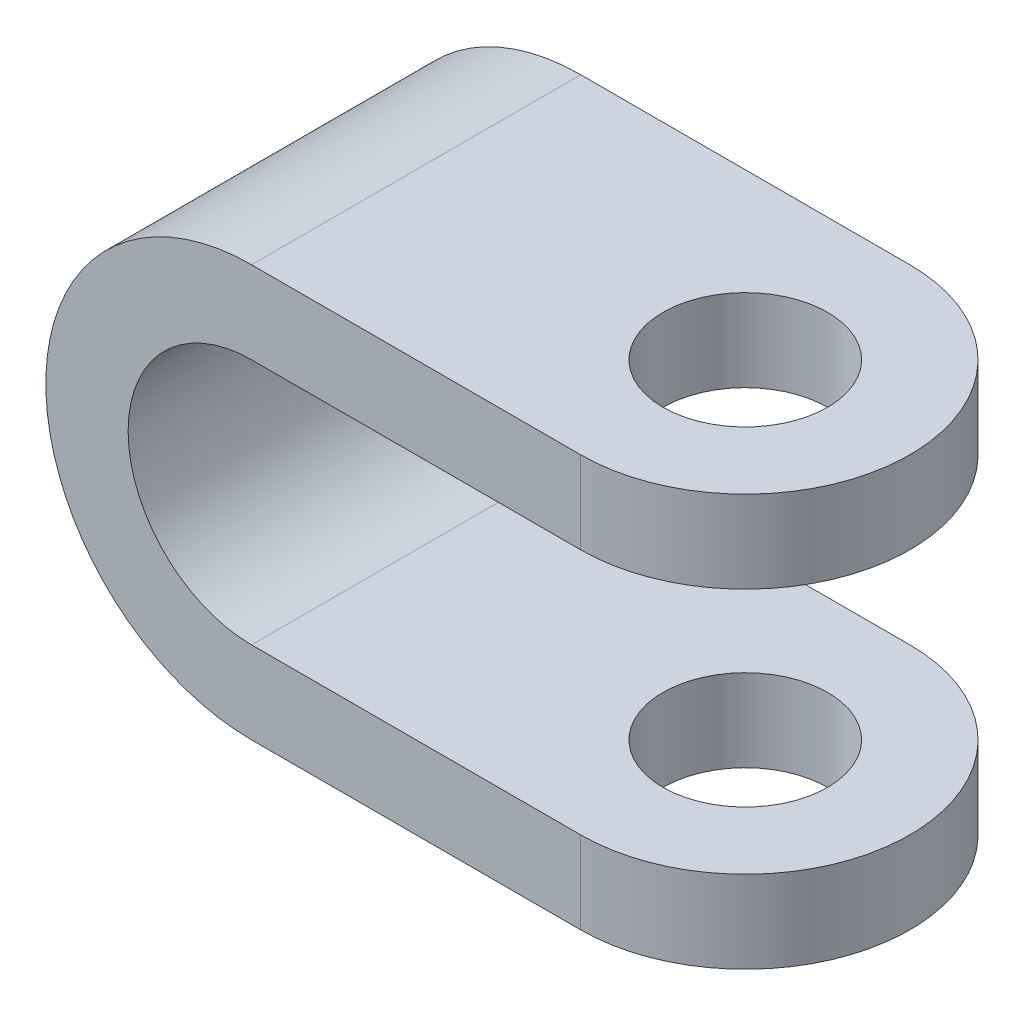
ISO-10303-21;
HEADER;
FILE_DESCRIPTION(('STEP AP214'),'2;1');
FILE_NAME('part.step','',(''),(''),'','','');
FILE_SCHEMA(('AUTOMOTIVE_DESIGN { 1 0 10303 214 1 1 1 1 }'));
ENDSEC;
DATA;
#1=APPLICATION_CONTEXT('core data for automotive mechanical design processes');
#2=APPLICATION_PROTOCOL_DEFINITION('international standard','automotive_design',2000,#1);
#3=PRODUCT_CONTEXT('',#1,'mechanical');
#4=PRODUCT('Part','Part','',(#3));
#5=PRODUCT_RELATED_PRODUCT_CATEGORY('part','',(#4));
#6=PRODUCT_DEFINITION_FORMATION('','',#4);
#7=PRODUCT_DEFINITION_CONTEXT('part definition',#1,'design');
#8=PRODUCT_DEFINITION('design','',#6,#7);
#9=PRODUCT_DEFINITION_SHAPE('','',#8);
#10=(LENGTH_UNIT() NAMED_UNIT(*) SI_UNIT(.MILLI.,.METRE.));
#11=(NAMED_UNIT(*) PLANE_ANGLE_UNIT() SI_UNIT($,.RADIAN.));
#12=(NAMED_UNIT(*) SI_UNIT($,.STERADIAN.) SOLID_ANGLE_UNIT());
#13=UNCERTAINTY_MEASURE_WITH_UNIT(LENGTH_MEASURE(1.E-05),#10,'distance_accuracy_value','');
#14=(GEOMETRIC_REPRESENTATION_CONTEXT(3) GLOBAL_UNCERTAINTY_ASSIGNED_CONTEXT((#13)) GLOBAL_UNIT_ASSIGNED_CONTEXT((#10,
#11,#12)) REPRESENTATION_CONTEXT('',''));
#15=CARTESIAN_POINT('',(0.,0.,0.));
#16=DIRECTION('',(0.,0.,1.));
#17=DIRECTION('',(1.,0.,0.));
#18=AXIS2_PLACEMENT_3D('',#15,#16,#17);
#19=CARTESIAN_POINT('',(-85.,-90.,65.));
#20=DIRECTION('',(0.,0.,1.));
#21=DIRECTION('',(1.,0.,0.));
#22=AXIS2_PLACEMENT_3D('',#19,#20,#21);
#23=PLANE('',#22);
#24=DIRECTION('',(1.,0.,0.));
#25=VECTOR('',#24,1.);
#26=CARTESIAN_POINT('',(-60.,-55.,65.));
#27=LINE('',#26,#25);
#28=CARTESIAN_POINT('',(-60.,-55.,65.));
#29=VERTEX_POINT('',#28);
#30=CARTESIAN_POINT('',(-20.,-55.,65.));
#31=VERTEX_POINT('',#30);
#32=EDGE_CURVE('E128',#29,#31,#27,.T.);
#33=ORIENTED_EDGE('',*,*,#32,.F.);
#34=CARTESIAN_POINT('',(-60.,-40.,65.));
#35=DIRECTION('',(0.,0.,1.));
#36=DIRECTION('',(1.,0.,0.));
#37=AXIS2_PLACEMENT_3D('',#34,#35,#36);
#38=CIRCLE('',#37,15.);
#39=CARTESIAN_POINT('',(-60.,-25.,65.));
#40=VERTEX_POINT('',#39);
#41=EDGE_CURVE('E141',#40,#29,#38,.T.);
#42=ORIENTED_EDGE('',*,*,#41,.F.);
#43=DIRECTION('',(-1.,0.,0.));
#44=VECTOR('',#43,1.);
#45=CARTESIAN_POINT('',(0.,-25.,65.));
#46=LINE('',#45,#44);
#47=CARTESIAN_POINT('',(-20.,-25.,65.));
#48=VERTEX_POINT('',#47);
#49=EDGE_CURVE('E148',#48,#40,#46,.T.);
#50=ORIENTED_EDGE('',*,*,#49,.F.);
#51=DIRECTION('',(0.,1.,0.));
#52=VECTOR('',#51,1.);
#53=CARTESIAN_POINT('',(-20.,-90.,65.));
#54=LINE('',#53,#52);
#55=CARTESIAN_POINT('',(-20.,-15.,65.));
#56=VERTEX_POINT('',#55);
#57=EDGE_CURVE('E133',#48,#56,#54,.T.);
#58=ORIENTED_EDGE('',*,*,#57,.T.);
#59=DIRECTION('',(-1.,0.,0.));
#60=VECTOR('',#59,1.);
#61=CARTESIAN_POINT('',(0.,-15.,65.));
#62=LINE('',#61,#60);
#63=CARTESIAN_POINT('',(-60.,-15.,65.));
#64=VERTEX_POINT('',#63);
#65=EDGE_CURVE('E248',#56,#64,#62,.T.);
#66=ORIENTED_EDGE('',*,*,#65,.T.);
#67=CARTESIAN_POINT('',(-60.,-40.,65.));
#68=DIRECTION('',(0.,0.,1.));
#69=DIRECTION('',(1.,0.,0.));
#70=AXIS2_PLACEMENT_3D('',#67,#68,#69);
#71=CIRCLE('',#70,25.);
#72=CARTESIAN_POINT('',(-60.,-65.,65.));
#73=VERTEX_POINT('',#72);
#74=EDGE_CURVE('E192',#64,#73,#71,.T.);
#75=ORIENTED_EDGE('',*,*,#74,.T.);
#76=DIRECTION('',(1.,0.,0.));
#77=VECTOR('',#76,1.);
#78=CARTESIAN_POINT('',(-60.,-65.,65.));
#79=LINE('',#78,#77);
#80=CARTESIAN_POINT('',(-20.,-65.,65.));
#81=VERTEX_POINT('',#80);
#82=EDGE_CURVE('E130',#73,#81,#79,.T.);
#83=ORIENTED_EDGE('',*,*,#82,.T.);
#84=EDGE_CURVE('E117',#81,#31,#54,.T.);
#85=ORIENTED_EDGE('',*,*,#84,.T.);
#86=EDGE_LOOP('',(#33,#42,#50,#58,#66,#75,#83,#85));
#87=FACE_BOUND('',#86,.T.);
#88=ADVANCED_FACE('F49',(#87),#23,.T.);
#89=CARTESIAN_POINT('',(-20.,-90.,25.));
#90=DIRECTION('',(0.,0.,-1.));
#91=DIRECTION('',(-1.,0.,0.));
#92=AXIS2_PLACEMENT_3D('',#89,#90,#91);
#93=PLANE('',#92);
#94=DIRECTION('',(-1.,0.,0.));
#95=VECTOR('',#94,1.);
#96=CARTESIAN_POINT('',(-60.,-55.,25.));
#97=LINE('',#96,#95);
#98=CARTESIAN_POINT('',(-20.,-55.,25.));
#99=VERTEX_POINT('',#98);
#100=CARTESIAN_POINT('',(-60.,-55.,25.));
#101=VERTEX_POINT('',#100);
#102=EDGE_CURVE('E163',#99,#101,#97,.T.);
#103=ORIENTED_EDGE('',*,*,#102,.F.);
#104=DIRECTION('',(0.,1.,0.));
#105=VECTOR('',#104,1.);
#106=CARTESIAN_POINT('',(-20.,-90.,25.));
#107=LINE('',#106,#105);
#108=CARTESIAN_POINT('',(-20.,-65.,25.));
#109=VERTEX_POINT('',#108);
#110=EDGE_CURVE('E119',#109,#99,#107,.T.);
#111=ORIENTED_EDGE('',*,*,#110,.F.);
#112=DIRECTION('',(-1.,0.,0.));
#113=VECTOR('',#112,1.);
#114=CARTESIAN_POINT('',(-60.,-65.,25.));
#115=LINE('',#114,#113);
#116=CARTESIAN_POINT('',(-60.,-65.,25.0000000000001));
#117=VERTEX_POINT('',#116);
#118=EDGE_CURVE('E146',#109,#117,#115,.T.);
#119=ORIENTED_EDGE('',*,*,#118,.T.);
#120=CARTESIAN_POINT('',(-60.,-40.,25.));
#121=DIRECTION('',(0.,0.,-1.));
#122=DIRECTION('',(-1.,0.,0.));
#123=AXIS2_PLACEMENT_3D('',#120,#121,#122);
#124=CIRCLE('',#123,25.);
#125=CARTESIAN_POINT('',(-60.,-15.,25.0000000000001));
#126=VERTEX_POINT('',#125);
#127=EDGE_CURVE('E195',#117,#126,#124,.T.);
#128=ORIENTED_EDGE('',*,*,#127,.T.);
#129=DIRECTION('',(1.,0.,0.));
#130=VECTOR('',#129,1.);
#131=CARTESIAN_POINT('',(0.,-15.,25.));
#132=LINE('',#131,#130);
#133=CARTESIAN_POINT('',(-20.,-15.,25.));
#134=VERTEX_POINT('',#133);
#135=EDGE_CURVE('E140',#126,#134,#132,.T.);
#136=ORIENTED_EDGE('',*,*,#135,.T.);
#137=CARTESIAN_POINT('',(-20.,-25.,25.));
#138=VERTEX_POINT('',#137);
#139=EDGE_CURVE('E132',#138,#134,#107,.T.);
#140=ORIENTED_EDGE('',*,*,#139,.F.);
#141=DIRECTION('',(1.,0.,0.));
#142=VECTOR('',#141,1.);
#143=CARTESIAN_POINT('',(0.,-25.,25.));
#144=LINE('',#143,#142);
#145=CARTESIAN_POINT('',(-60.,-25.,25.));
#146=VERTEX_POINT('',#145);
#147=EDGE_CURVE('E155',#146,#138,#144,.T.);
#148=ORIENTED_EDGE('',*,*,#147,.F.);
#149=CARTESIAN_POINT('',(-60.,-40.,25.));
#150=DIRECTION('',(0.,0.,-1.));
#151=DIRECTION('',(-1.,0.,0.));
#152=AXIS2_PLACEMENT_3D('',#149,#150,#151);
#153=CIRCLE('',#152,15.);
#154=EDGE_CURVE('E159',#101,#146,#153,.T.);
#155=ORIENTED_EDGE('',*,*,#154,.F.);
#156=EDGE_LOOP('',(#103,#111,#119,#128,#136,#140,#148,#155));
#157=FACE_BOUND('',#156,.T.);
#158=ADVANCED_FACE('F220',(#157),#93,.T.);
#159=CARTESIAN_POINT('',(-20.,-90.,45.));
#160=DIRECTION('',(0.,1.,0.));
#161=DIRECTION('',(0.,0.,1.));
#162=AXIS2_PLACEMENT_3D('',#159,#160,#161);
#163=CYLINDRICAL_SURFACE('',#162,20.);
#164=CARTESIAN_POINT('',(-20.,-25.,45.));
#165=DIRECTION('',(0.,-1.,0.));
#166=DIRECTION('',(1.,0.,0.));
#167=AXIS2_PLACEMENT_3D('',#164,#165,#166);
#168=CIRCLE('',#167,20.);
#169=EDGE_CURVE('E125',#138,#48,#168,.T.);
#170=ORIENTED_EDGE('',*,*,#169,.F.);
#171=ORIENTED_EDGE('',*,*,#139,.T.);
#172=CARTESIAN_POINT('',(-20.,-15.,45.));
#173=DIRECTION('',(0.,-1.,0.));
#174=DIRECTION('',(1.,0.,0.));
#175=AXIS2_PLACEMENT_3D('',#172,#173,#174);
#176=CIRCLE('',#175,20.);
#177=EDGE_CURVE('E53',#134,#56,#176,.T.);
#178=ORIENTED_EDGE('',*,*,#177,.T.);
#179=ORIENTED_EDGE('',*,*,#57,.F.);
#180=EDGE_LOOP('',(#170,#171,#178,#179));
#181=FACE_BOUND('',#180,.T.);
#182=ADVANCED_FACE('F224',(#181),#163,.T.);
#183=ORIENTED_EDGE('',*,*,#84,.F.);
#184=CARTESIAN_POINT('',(-20.,-65.,45.));
#185=DIRECTION('',(0.,1.,0.));
#186=DIRECTION('',(-1.,0.,0.));
#187=AXIS2_PLACEMENT_3D('',#184,#185,#186);
#188=CIRCLE('',#187,20.);
#189=EDGE_CURVE('E67',#81,#109,#188,.T.);
#190=ORIENTED_EDGE('',*,*,#189,.T.);
#191=ORIENTED_EDGE('',*,*,#110,.T.);
#192=CARTESIAN_POINT('',(-20.,-55.,45.));
#193=DIRECTION('',(0.,1.,0.));
#194=DIRECTION('',(-1.,0.,0.));
#195=AXIS2_PLACEMENT_3D('',#192,#193,#194);
#196=CIRCLE('',#195,20.);
#197=EDGE_CURVE('E114',#31,#99,#196,.T.);
#198=ORIENTED_EDGE('',*,*,#197,.F.);
#199=EDGE_LOOP('',(#183,#190,#191,#198));
#200=FACE_BOUND('',#199,.T.);
#201=ADVANCED_FACE('F116',(#200),#163,.T.);
#202=CARTESIAN_POINT('',(-60.,-40.,90.));
#203=DIRECTION('',(0.,0.,-1.));
#204=DIRECTION('',(-1.,0.,0.));
#205=AXIS2_PLACEMENT_3D('',#202,#203,#204);
#206=CYLINDRICAL_SURFACE('',#205,25.);
#207=DIRECTION('',(0.,0.,-1.));
#208=VECTOR('',#207,1.);
#209=CARTESIAN_POINT('',(-60.,-65.,90.));
#210=LINE('',#209,#208);
#211=EDGE_CURVE('E178',#73,#117,#210,.T.);
#212=ORIENTED_EDGE('',*,*,#211,.F.);
#213=ORIENTED_EDGE('',*,*,#74,.F.);
#214=DIRECTION('',(0.,0.,-1.));
#215=VECTOR('',#214,1.);
#216=CARTESIAN_POINT('',(-60.,-15.,90.));
#217=LINE('',#216,#215);
#218=EDGE_CURVE('E182',#64,#126,#217,.T.);
#219=ORIENTED_EDGE('',*,*,#218,.T.);
#220=ORIENTED_EDGE('',*,*,#127,.F.);
#221=EDGE_LOOP('',(#212,#213,#219,#220));
#222=FACE_BOUND('',#221,.T.);
#223=ADVANCED_FACE('F228',(#222),#206,.T.);
#224=CARTESIAN_POINT('',(0.,-15.,90.));
#225=DIRECTION('',(0.,-1.,0.));
#226=DIRECTION('',(1.,0.,0.));
#227=AXIS2_PLACEMENT_3D('',#224,#225,#226);
#228=PLANE('',#227);
#229=CARTESIAN_POINT('',(-20.,-15.,45.));
#230=DIRECTION('',(0.,-1.,0.));
#231=DIRECTION('',(1.,0.,0.));
#232=AXIS2_PLACEMENT_3D('',#229,#230,#231);
#233=CIRCLE('',#232,10.);
#234=CARTESIAN_POINT('',(-20.,-15.,55.));
#235=VERTEX_POINT('',#234);
#236=EDGE_CURVE('E166',#235,#235,#233,.T.);
#237=ORIENTED_EDGE('',*,*,#236,.T.);
#238=EDGE_LOOP('',(#237));
#239=FACE_BOUND('',#238,.T.);
#240=ORIENTED_EDGE('',*,*,#135,.F.);
#241=ORIENTED_EDGE('',*,*,#218,.F.);
#242=ORIENTED_EDGE('',*,*,#65,.F.);
#243=ORIENTED_EDGE('',*,*,#177,.F.);
#244=EDGE_LOOP('',(#240,#241,#242,#243));
#245=FACE_BOUND('',#244,.T.);
#246=ADVANCED_FACE('F201',(#239,#245),#228,.F.);
#247=CARTESIAN_POINT('',(-60.,-65.,90.));
#248=DIRECTION('',(0.,1.,0.));
#249=DIRECTION('',(-1.,0.,0.));
#250=AXIS2_PLACEMENT_3D('',#247,#248,#249);
#251=PLANE('',#250);
#252=CARTESIAN_POINT('',(-20.,-65.,45.));
#253=DIRECTION('',(0.,1.,0.));
#254=DIRECTION('',(-1.,0.,0.));
#255=AXIS2_PLACEMENT_3D('',#252,#253,#254);
#256=CIRCLE('',#255,10.);
#257=CARTESIAN_POINT('',(-20.,-65.,55.));
#258=VERTEX_POINT('',#257);
#259=EDGE_CURVE('E170',#258,#258,#256,.T.);
#260=ORIENTED_EDGE('',*,*,#259,.T.);
#261=EDGE_LOOP('',(#260));
#262=FACE_BOUND('',#261,.T.);
#263=ORIENTED_EDGE('',*,*,#118,.F.);
#264=ORIENTED_EDGE('',*,*,#189,.F.);
#265=ORIENTED_EDGE('',*,*,#82,.F.);
#266=ORIENTED_EDGE('',*,*,#211,.T.);
#267=EDGE_LOOP('',(#263,#264,#265,#266));
#268=FACE_BOUND('',#267,.T.);
#269=ADVANCED_FACE('F51',(#262,#268),#251,.F.);
#270=CARTESIAN_POINT('',(-20.,-90.,45.));
#271=DIRECTION('',(0.,1.,0.));
#272=DIRECTION('',(0.,0.,1.));
#273=AXIS2_PLACEMENT_3D('',#270,#271,#272);
#274=CYLINDRICAL_SURFACE('',#273,10.);
#275=CARTESIAN_POINT('',(-20.,-25.,45.));
#276=DIRECTION('',(0.,-1.,0.));
#277=DIRECTION('',(1.,0.,0.));
#278=AXIS2_PLACEMENT_3D('',#275,#276,#277);
#279=CIRCLE('',#278,10.);
#280=CARTESIAN_POINT('',(-20.,-25.,55.));
#281=VERTEX_POINT('',#280);
#282=EDGE_CURVE('E59',#281,#281,#279,.T.);
#283=CARTESIAN_POINT('',(-20.,-25.,55.));
#284=CARTESIAN_POINT('',(-20.,-24.8958333333333,55.));
#285=CARTESIAN_POINT('',(-20.,-24.7916666666667,55.));
#286=CARTESIAN_POINT('',(-20.,-24.5833333333333,55.));
#287=CARTESIAN_POINT('',(-20.,-24.4791666666667,55.));
#288=CARTESIAN_POINT('',(-20.,-24.2708333333333,55.));
#289=CARTESIAN_POINT('',(-20.,-24.1666666666667,55.));
#290=CARTESIAN_POINT('',(-20.,-23.9583333333333,55.));
#291=CARTESIAN_POINT('',(-20.,-23.8541666666667,55.));
#292=CARTESIAN_POINT('',(-20.,-23.6458333333333,55.));
#293=CARTESIAN_POINT('',(-20.,-23.5416666666667,55.));
#294=CARTESIAN_POINT('',(-20.,-23.3333333333333,55.));
#295=CARTESIAN_POINT('',(-20.,-23.2291666666667,55.));
#296=CARTESIAN_POINT('',(-20.,-23.0208333333333,55.));
#297=CARTESIAN_POINT('',(-20.,-22.9166666666667,55.));
#298=CARTESIAN_POINT('',(-20.,-22.7083333333333,55.));
#299=CARTESIAN_POINT('',(-20.,-22.6041666666667,55.));
#300=CARTESIAN_POINT('',(-20.,-22.3958333333333,55.));
#301=CARTESIAN_POINT('',(-20.,-22.2916666666667,55.));
#302=CARTESIAN_POINT('',(-20.,-22.0833333333333,55.));
#303=CARTESIAN_POINT('',(-20.,-21.9791666666667,55.));
#304=CARTESIAN_POINT('',(-20.,-21.7708333333333,55.));
#305=CARTESIAN_POINT('',(-20.,-21.6666666666667,55.));
#306=CARTESIAN_POINT('',(-20.,-21.4583333333333,55.));
#307=CARTESIAN_POINT('',(-20.,-21.3541666666667,55.));
#308=CARTESIAN_POINT('',(-20.,-21.1458333333333,55.));
#309=CARTESIAN_POINT('',(-20.,-21.0416666666667,55.));
#310=CARTESIAN_POINT('',(-20.,-20.8333333333333,55.));
#311=CARTESIAN_POINT('',(-20.,-20.7291666666667,55.));
#312=CARTESIAN_POINT('',(-20.,-20.5208333333333,55.));
#313=CARTESIAN_POINT('',(-20.,-20.4166666666667,55.));
#314=CARTESIAN_POINT('',(-20.,-20.2083333333333,55.));
#315=CARTESIAN_POINT('',(-20.,-20.1041666666667,55.));
#316=CARTESIAN_POINT('',(-20.,-19.8958333333333,55.));
#317=CARTESIAN_POINT('',(-20.,-19.7916666666667,55.));
#318=CARTESIAN_POINT('',(-20.,-19.5833333333333,55.));
#319=CARTESIAN_POINT('',(-20.,-19.4791666666667,55.));
#320=CARTESIAN_POINT('',(-20.,-19.2708333333333,55.));
#321=CARTESIAN_POINT('',(-20.,-19.1666666666667,55.));
#322=CARTESIAN_POINT('',(-20.,-18.9583333333333,55.));
#323=CARTESIAN_POINT('',(-20.,-18.8541666666667,55.));
#324=CARTESIAN_POINT('',(-20.,-18.6458333333333,55.));
#325=CARTESIAN_POINT('',(-20.,-18.5416666666667,55.));
#326=CARTESIAN_POINT('',(-20.,-18.3333333333333,55.));
#327=CARTESIAN_POINT('',(-20.,-18.2291666666667,55.));
#328=CARTESIAN_POINT('',(-20.,-18.0208333333333,55.));
#329=CARTESIAN_POINT('',(-20.,-17.9166666666667,55.));
#330=CARTESIAN_POINT('',(-20.,-17.7083333333333,55.));
#331=CARTESIAN_POINT('',(-20.,-17.6041666666667,55.));
#332=CARTESIAN_POINT('',(-20.,-17.3958333333333,55.));
#333=CARTESIAN_POINT('',(-20.,-17.2916666666667,55.));
#334=CARTESIAN_POINT('',(-20.,-17.0833333333333,55.));
#335=CARTESIAN_POINT('',(-20.,-16.9791666666667,55.));
#336=CARTESIAN_POINT('',(-20.,-16.7708333333333,55.));
#337=CARTESIAN_POINT('',(-20.,-16.6666666666667,55.));
#338=CARTESIAN_POINT('',(-20.,-16.4583333333333,55.));
#339=CARTESIAN_POINT('',(-20.,-16.3541666666667,55.));
#340=CARTESIAN_POINT('',(-20.,-16.1458333333333,55.));
#341=CARTESIAN_POINT('',(-20.,-16.0416666666667,55.));
#342=CARTESIAN_POINT('',(-20.,-15.8333333333333,55.));
#343=CARTESIAN_POINT('',(-20.,-15.7291666666667,55.));
#344=CARTESIAN_POINT('',(-20.,-15.5208333333333,55.));
#345=CARTESIAN_POINT('',(-20.,-15.4166666666667,55.));
#346=CARTESIAN_POINT('',(-20.,-15.2083333333333,55.));
#347=CARTESIAN_POINT('',(-20.,-15.1041666666667,55.));
#348=CARTESIAN_POINT('',(-20.,-15.,55.));
#349=B_SPLINE_CURVE_WITH_KNOTS('',3,(#283,#284,#285,#286,#287,#288,#289,#290,#291,#292,#293,
#294,#295,#296,#297,#298,#299,#300,#301,#302,#303,#304,#305,#306,#307,#308,#309,#310,#311,#312,
#313,#314,#315,#316,#317,#318,#319,#320,#321,#322,#323,#324,#325,#326,#327,#328,#329,#330,#331,
#332,#333,#334,#335,#336,#337,#338,#339,#340,#341,#342,#343,#344,#345,#346,#347,#348),
.UNSPECIFIED.,.F.,.F.,(4,2,2,2,2,2,2,2,2,2,2,2,2,2,2,2,2,2,2,2,2,2,2,2,2,2,2,2,2,2,2,2,4),(0.,
0.312499999999993,0.625000000000001,0.937500000000008,1.25,1.56249999999999,1.875,
2.18750000000001,2.5,2.8125,3.125,3.43750000000001,3.75,4.0625,4.375,4.68750000000001,5.,5.3125,
5.62500000000001,5.93750000000001,6.25000000000001,6.5625,6.87500000000001,7.18750000000001,
7.50000000000001,7.8125,8.12500000000001,8.43750000000001,8.75000000000001,9.0625,
9.37500000000001,9.68750000000002,10.),.UNSPECIFIED.);
#350=EDGE_CURVE('BSEAM204',#281,#235,#349,.T.);
#351=ORIENTED_EDGE('',*,*,#282,.T.);
#352=ORIENTED_EDGE('',*,*,#236,.F.);
#353=ORIENTED_EDGE('',*,*,#350,.T.);
#354=ORIENTED_EDGE('',*,*,#350,.F.);
#355=EDGE_LOOP('',(#351,#353,#352,#354));
#356=FACE_BOUND('',#355,.T.);
#357=ADVANCED_FACE('F204',(#356),#274,.F.);
#358=CARTESIAN_POINT('',(-60.,-55.,90.));
#359=DIRECTION('',(0.,1.,0.));
#360=DIRECTION('',(-1.,0.,0.));
#361=AXIS2_PLACEMENT_3D('',#358,#359,#360);
#362=PLANE('',#361);
#363=CARTESIAN_POINT('',(-20.,-55.,45.));
#364=DIRECTION('',(0.,1.,0.));
#365=DIRECTION('',(-1.,0.,0.));
#366=AXIS2_PLACEMENT_3D('',#363,#364,#365);
#367=CIRCLE('',#366,10.);
#368=CARTESIAN_POINT('',(-20.,-55.,55.));
#369=VERTEX_POINT('',#368);
#370=EDGE_CURVE('E11',#369,#369,#367,.T.);
#371=ORIENTED_EDGE('',*,*,#370,.F.);
#372=EDGE_LOOP('',(#371));
#373=FACE_BOUND('',#372,.T.);
#374=ORIENTED_EDGE('',*,*,#197,.T.);
#375=ORIENTED_EDGE('',*,*,#102,.T.);
#376=DIRECTION('',(0.,0.,-1.));
#377=VECTOR('',#376,1.);
#378=CARTESIAN_POINT('',(-60.,-55.,90.));
#379=LINE('',#378,#377);
#380=EDGE_CURVE('E138',#29,#101,#379,.T.);
#381=ORIENTED_EDGE('',*,*,#380,.F.);
#382=ORIENTED_EDGE('',*,*,#32,.T.);
#383=EDGE_LOOP('',(#374,#375,#381,#382));
#384=FACE_BOUND('',#383,.T.);
#385=ADVANCED_FACE('F136',(#373,#384),#362,.T.);
#386=CARTESIAN_POINT('',(0.,-25.,90.));
#387=DIRECTION('',(0.,-1.,0.));
#388=DIRECTION('',(1.,0.,0.));
#389=AXIS2_PLACEMENT_3D('',#386,#387,#388);
#390=PLANE('',#389);
#391=ORIENTED_EDGE('',*,*,#282,.F.);
#392=EDGE_LOOP('',(#391));
#393=FACE_BOUND('',#392,.T.);
#394=DIRECTION('',(0.,0.,-1.));
#395=VECTOR('',#394,1.);
#396=CARTESIAN_POINT('',(-60.,-25.,90.));
#397=LINE('',#396,#395);
#398=EDGE_CURVE('E186',#40,#146,#397,.T.);
#399=ORIENTED_EDGE('',*,*,#398,.T.);
#400=ORIENTED_EDGE('',*,*,#147,.T.);
#401=ORIENTED_EDGE('',*,*,#169,.T.);
#402=ORIENTED_EDGE('',*,*,#49,.T.);
#403=EDGE_LOOP('',(#399,#400,#401,#402));
#404=FACE_BOUND('',#403,.T.);
#405=ADVANCED_FACE('F212',(#393,#404),#390,.T.);
#406=CARTESIAN_POINT('',(-60.,-40.,90.));
#407=DIRECTION('',(0.,0.,-1.));
#408=DIRECTION('',(-1.,0.,0.));
#409=AXIS2_PLACEMENT_3D('',#406,#407,#408);
#410=CYLINDRICAL_SURFACE('',#409,15.);
#411=ORIENTED_EDGE('',*,*,#380,.T.);
#412=ORIENTED_EDGE('',*,*,#154,.T.);
#413=ORIENTED_EDGE('',*,*,#398,.F.);
#414=ORIENTED_EDGE('',*,*,#41,.T.);
#415=EDGE_LOOP('',(#411,#412,#413,#414));
#416=FACE_BOUND('',#415,.T.);
#417=ADVANCED_FACE('F217',(#416),#410,.F.);
#418=CARTESIAN_POINT('',(-20.,-55.,55.));
#419=CARTESIAN_POINT('',(-20.,-55.1041666666667,55.));
#420=CARTESIAN_POINT('',(-20.,-55.2083333333333,55.));
#421=CARTESIAN_POINT('',(-20.,-55.4166666666667,55.));
#422=CARTESIAN_POINT('',(-20.,-55.5208333333333,55.));
#423=CARTESIAN_POINT('',(-20.,-55.7291666666667,55.));
#424=CARTESIAN_POINT('',(-20.,-55.8333333333333,55.));
#425=CARTESIAN_POINT('',(-20.,-56.0416666666667,55.));
#426=CARTESIAN_POINT('',(-20.,-56.1458333333333,55.));
#427=CARTESIAN_POINT('',(-20.,-56.3541666666667,55.));
#428=CARTESIAN_POINT('',(-20.,-56.4583333333333,55.));
#429=CARTESIAN_POINT('',(-20.,-56.6666666666667,55.));
#430=CARTESIAN_POINT('',(-20.,-56.7708333333333,55.));
#431=CARTESIAN_POINT('',(-20.,-56.9791666666667,55.));
#432=CARTESIAN_POINT('',(-20.,-57.0833333333333,55.));
#433=CARTESIAN_POINT('',(-20.,-57.2916666666667,55.));
#434=CARTESIAN_POINT('',(-20.,-57.3958333333333,55.));
#435=CARTESIAN_POINT('',(-20.,-57.6041666666667,55.));
#436=CARTESIAN_POINT('',(-20.,-57.7083333333333,55.));
#437=CARTESIAN_POINT('',(-20.,-57.9166666666667,55.));
#438=CARTESIAN_POINT('',(-20.,-58.0208333333333,55.));
#439=CARTESIAN_POINT('',(-20.,-58.2291666666667,55.));
#440=CARTESIAN_POINT('',(-20.,-58.3333333333333,55.));
#441=CARTESIAN_POINT('',(-20.,-58.5416666666667,55.));
#442=CARTESIAN_POINT('',(-20.,-58.6458333333333,55.));
#443=CARTESIAN_POINT('',(-20.,-58.8541666666667,55.));
#444=CARTESIAN_POINT('',(-20.,-58.9583333333333,55.));
#445=CARTESIAN_POINT('',(-20.,-59.1666666666667,55.));
#446=CARTESIAN_POINT('',(-20.,-59.2708333333333,55.));
#447=CARTESIAN_POINT('',(-20.,-59.4791666666667,55.));
#448=CARTESIAN_POINT('',(-20.,-59.5833333333333,55.));
#449=CARTESIAN_POINT('',(-20.,-59.7916666666667,55.));
#450=CARTESIAN_POINT('',(-20.,-59.8958333333333,55.));
#451=CARTESIAN_POINT('',(-20.,-60.1041666666667,55.));
#452=CARTESIAN_POINT('',(-20.,-60.2083333333333,55.));
#453=CARTESIAN_POINT('',(-20.,-60.4166666666667,55.));
#454=CARTESIAN_POINT('',(-20.,-60.5208333333333,55.));
#455=CARTESIAN_POINT('',(-20.,-60.7291666666667,55.));
#456=CARTESIAN_POINT('',(-20.,-60.8333333333333,55.));
#457=CARTESIAN_POINT('',(-20.,-61.0416666666667,55.));
#458=CARTESIAN_POINT('',(-20.,-61.1458333333333,55.));
#459=CARTESIAN_POINT('',(-20.,-61.3541666666667,55.));
#460=CARTESIAN_POINT('',(-20.,-61.4583333333333,55.));
#461=CARTESIAN_POINT('',(-20.,-61.6666666666667,55.));
#462=CARTESIAN_POINT('',(-20.,-61.7708333333333,55.));
#463=CARTESIAN_POINT('',(-20.,-61.9791666666667,55.));
#464=CARTESIAN_POINT('',(-20.,-62.0833333333333,55.));
#465=CARTESIAN_POINT('',(-20.,-62.2916666666667,55.));
#466=CARTESIAN_POINT('',(-20.,-62.3958333333333,55.));
#467=CARTESIAN_POINT('',(-20.,-62.6041666666667,55.));
#468=CARTESIAN_POINT('',(-20.,-62.7083333333333,55.));
#469=CARTESIAN_POINT('',(-20.,-62.9166666666667,55.));
#470=CARTESIAN_POINT('',(-20.,-63.0208333333333,55.));
#471=CARTESIAN_POINT('',(-20.,-63.2291666666667,55.));
#472=CARTESIAN_POINT('',(-20.,-63.3333333333333,55.));
#473=CARTESIAN_POINT('',(-20.,-63.5416666666667,55.));
#474=CARTESIAN_POINT('',(-20.,-63.6458333333333,55.));
#475=CARTESIAN_POINT('',(-20.,-63.8541666666667,55.));
#476=CARTESIAN_POINT('',(-20.,-63.9583333333333,55.));
#477=CARTESIAN_POINT('',(-20.,-64.1666666666667,55.));
#478=CARTESIAN_POINT('',(-20.,-64.2708333333333,55.));
#479=CARTESIAN_POINT('',(-20.,-64.4791666666667,55.));
#480=CARTESIAN_POINT('',(-20.,-64.5833333333333,55.));
#481=CARTESIAN_POINT('',(-20.,-64.7916666666667,55.));
#482=CARTESIAN_POINT('',(-20.,-64.8958333333333,55.));
#483=CARTESIAN_POINT('',(-20.,-65.,55.));
#484=B_SPLINE_CURVE_WITH_KNOTS('',3,(#418,#419,#420,#421,#422,#423,#424,#425,#426,#427,#428,
#429,#430,#431,#432,#433,#434,#435,#436,#437,#438,#439,#440,#441,#442,#443,#444,#445,#446,#447,
#448,#449,#450,#451,#452,#453,#454,#455,#456,#457,#458,#459,#460,#461,#462,#463,#464,#465,#466,
#467,#468,#469,#470,#471,#472,#473,#474,#475,#476,#477,#478,#479,#480,#481,#482,#483),
.UNSPECIFIED.,.F.,.F.,(4,2,2,2,2,2,2,2,2,2,2,2,2,2,2,2,2,2,2,2,2,2,2,2,2,2,2,2,2,2,2,2,4),(0.,
0.3125,0.625000000000001,0.937500000000001,1.25,1.5625,1.875,2.1875,2.5,2.8125,3.125,3.4375,
3.75,4.0625,4.375,4.6875,5.,5.3125,5.625,5.9375,6.25,6.5625,6.875,7.18749999999999,7.5,
7.81249999999999,8.125,8.43749999999999,8.75,9.06249999999999,9.375,9.68749999999999,10.),.UNSPECIFIED.);
#485=EDGE_CURVE('BSEAM208',#369,#258,#484,.T.);
#486=ORIENTED_EDGE('',*,*,#370,.T.);
#487=ORIENTED_EDGE('',*,*,#259,.F.);
#488=ORIENTED_EDGE('',*,*,#485,.T.);
#489=ORIENTED_EDGE('',*,*,#485,.F.);
#490=EDGE_LOOP('',(#486,#488,#487,#489));
#491=FACE_BOUND('',#490,.T.);
#492=ADVANCED_FACE('F208',(#491),#274,.F.);
#493=CLOSED_SHELL('',(#88,#158,#182,#201,#223,#246,#269,#357,#385,#405,#417,#492));
#494=MANIFOLD_SOLID_BREP('B2',#493);
#495=ADVANCED_BREP_SHAPE_REPRESENTATION('',(#18,#494),#14);
#496=SHAPE_DEFINITION_REPRESENTATION(#9,#495);
ENDSEC;
END-ISO-10303-21;
